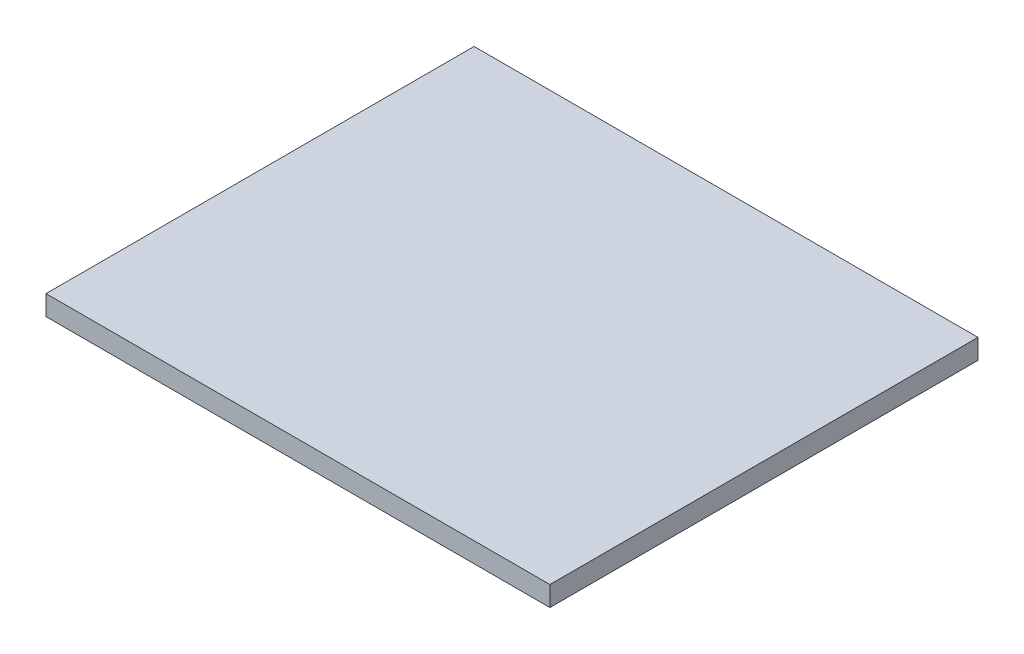
ISO-10303-21;
HEADER;
FILE_DESCRIPTION(('STEP AP214'),'2;1');
FILE_NAME('part.step','',(''),(''),'','','');
FILE_SCHEMA(('AUTOMOTIVE_DESIGN { 1 0 10303 214 1 1 1 1 }'));
ENDSEC;
DATA;
#1=APPLICATION_CONTEXT('core data for automotive mechanical design processes');
#2=APPLICATION_PROTOCOL_DEFINITION('international standard','automotive_design',2000,#1);
#3=PRODUCT_CONTEXT('',#1,'mechanical');
#4=PRODUCT('Part','Part','',(#3));
#5=PRODUCT_RELATED_PRODUCT_CATEGORY('part','',(#4));
#6=PRODUCT_DEFINITION_FORMATION('','',#4);
#7=PRODUCT_DEFINITION_CONTEXT('part definition',#1,'design');
#8=PRODUCT_DEFINITION('design','',#6,#7);
#9=PRODUCT_DEFINITION_SHAPE('','',#8);
#10=(LENGTH_UNIT() NAMED_UNIT(*) SI_UNIT(.MILLI.,.METRE.));
#11=(NAMED_UNIT(*) PLANE_ANGLE_UNIT() SI_UNIT($,.RADIAN.));
#12=(NAMED_UNIT(*) SI_UNIT($,.STERADIAN.) SOLID_ANGLE_UNIT());
#13=UNCERTAINTY_MEASURE_WITH_UNIT(LENGTH_MEASURE(1.E-05),#10,'distance_accuracy_value','');
#14=(GEOMETRIC_REPRESENTATION_CONTEXT(3) GLOBAL_UNCERTAINTY_ASSIGNED_CONTEXT((#13)) GLOBAL_UNIT_ASSIGNED_CONTEXT((#10,
#11,#12)) REPRESENTATION_CONTEXT('',''));
#15=CARTESIAN_POINT('',(0.,0.,0.));
#16=DIRECTION('',(0.,0.,1.));
#17=DIRECTION('',(1.,0.,0.));
#18=AXIS2_PLACEMENT_3D('',#15,#16,#17);
#19=CARTESIAN_POINT('',(0.,3.,0.));
#20=DIRECTION('',(1.,0.,0.));
#21=DIRECTION('',(0.,0.,-1.));
#22=AXIS2_PLACEMENT_3D('',#19,#20,#21);
#23=PLANE('',#22);
#24=DIRECTION('',(0.,0.,1.));
#25=VECTOR('',#24,1.);
#26=CARTESIAN_POINT('',(0.,0.,0.));
#27=LINE('',#26,#25);
#28=CARTESIAN_POINT('',(0.,0.,0.));
#29=VERTEX_POINT('',#28);
#30=CARTESIAN_POINT('',(0.,0.,64.4));
#31=VERTEX_POINT('',#30);
#32=EDGE_CURVE('E107',#29,#31,#27,.T.);
#33=ORIENTED_EDGE('',*,*,#32,.T.);
#34=DIRECTION('',(0.,-1.,0.));
#35=VECTOR('',#34,1.);
#36=CARTESIAN_POINT('',(0.,3.,64.4));
#37=LINE('',#36,#35);
#38=CARTESIAN_POINT('',(0.,3.,64.4));
#39=VERTEX_POINT('',#38);
#40=EDGE_CURVE('E11',#39,#31,#37,.T.);
#41=ORIENTED_EDGE('',*,*,#40,.F.);
#42=DIRECTION('',(0.,0.,1.));
#43=VECTOR('',#42,1.);
#44=CARTESIAN_POINT('',(0.,3.,0.));
#45=LINE('',#44,#43);
#46=CARTESIAN_POINT('',(0.,3.,0.));
#47=VERTEX_POINT('',#46);
#48=EDGE_CURVE('E89',#47,#39,#45,.T.);
#49=ORIENTED_EDGE('',*,*,#48,.F.);
#50=DIRECTION('',(0.,-1.,0.));
#51=VECTOR('',#50,1.);
#52=CARTESIAN_POINT('',(0.,3.,0.));
#53=LINE('',#52,#51);
#54=EDGE_CURVE('E56',#47,#29,#53,.T.);
#55=ORIENTED_EDGE('',*,*,#54,.T.);
#56=EDGE_LOOP('',(#33,#41,#49,#55));
#57=FACE_BOUND('',#56,.T.);
#58=ADVANCED_FACE('F39',(#57),#23,.F.);
#59=CARTESIAN_POINT('',(0.,3.,64.4));
#60=DIRECTION('',(0.,0.,-1.));
#61=DIRECTION('',(-1.,0.,0.));
#62=AXIS2_PLACEMENT_3D('',#59,#60,#61);
#63=PLANE('',#62);
#64=DIRECTION('',(1.,0.,0.));
#65=VECTOR('',#64,1.);
#66=CARTESIAN_POINT('',(0.,0.,64.4));
#67=LINE('',#66,#65);
#68=CARTESIAN_POINT('',(75.8,0.,64.4));
#69=VERTEX_POINT('',#68);
#70=EDGE_CURVE('E95',#31,#69,#67,.T.);
#71=ORIENTED_EDGE('',*,*,#70,.T.);
#72=DIRECTION('',(0.,-1.,0.));
#73=VECTOR('',#72,1.);
#74=CARTESIAN_POINT('',(75.8,3.,64.4));
#75=LINE('',#74,#73);
#76=CARTESIAN_POINT('',(75.8,3.,64.4));
#77=VERTEX_POINT('',#76);
#78=EDGE_CURVE('E48',#77,#69,#75,.T.);
#79=ORIENTED_EDGE('',*,*,#78,.F.);
#80=DIRECTION('',(1.,0.,0.));
#81=VECTOR('',#80,1.);
#82=CARTESIAN_POINT('',(0.,3.,64.4));
#83=LINE('',#82,#81);
#84=EDGE_CURVE('E81',#39,#77,#83,.T.);
#85=ORIENTED_EDGE('',*,*,#84,.F.);
#86=ORIENTED_EDGE('',*,*,#40,.T.);
#87=EDGE_LOOP('',(#71,#79,#85,#86));
#88=FACE_BOUND('',#87,.T.);
#89=ADVANCED_FACE('F94',(#88),#63,.F.);
#90=CARTESIAN_POINT('',(75.8,3.,0.));
#91=DIRECTION('',(1.,0.,0.));
#92=DIRECTION('',(0.,0.,-1.));
#93=AXIS2_PLACEMENT_3D('',#90,#91,#92);
#94=PLANE('',#93);
#95=DIRECTION('',(0.,0.,1.));
#96=VECTOR('',#95,1.);
#97=CARTESIAN_POINT('',(75.8,0.,0.));
#98=LINE('',#97,#96);
#99=CARTESIAN_POINT('',(75.8,0.,0.));
#100=VERTEX_POINT('',#99);
#101=EDGE_CURVE('E112',#100,#69,#98,.T.);
#102=ORIENTED_EDGE('',*,*,#101,.F.);
#103=DIRECTION('',(0.,-1.,0.));
#104=VECTOR('',#103,1.);
#105=CARTESIAN_POINT('',(75.8,3.,0.));
#106=LINE('',#105,#104);
#107=CARTESIAN_POINT('',(75.8,3.,0.));
#108=VERTEX_POINT('',#107);
#109=EDGE_CURVE('E70',#108,#100,#106,.T.);
#110=ORIENTED_EDGE('',*,*,#109,.F.);
#111=DIRECTION('',(0.,0.,1.));
#112=VECTOR('',#111,1.);
#113=CARTESIAN_POINT('',(75.8,3.,0.));
#114=LINE('',#113,#112);
#115=EDGE_CURVE('E88',#108,#77,#114,.T.);
#116=ORIENTED_EDGE('',*,*,#115,.T.);
#117=ORIENTED_EDGE('',*,*,#78,.T.);
#118=EDGE_LOOP('',(#102,#110,#116,#117));
#119=FACE_BOUND('',#118,.T.);
#120=ADVANCED_FACE('F99',(#119),#94,.T.);
#121=CARTESIAN_POINT('',(0.,3.,0.));
#122=DIRECTION('',(0.,0.,-1.));
#123=DIRECTION('',(-1.,0.,0.));
#124=AXIS2_PLACEMENT_3D('',#121,#122,#123);
#125=PLANE('',#124);
#126=DIRECTION('',(1.,0.,0.));
#127=VECTOR('',#126,1.);
#128=CARTESIAN_POINT('',(0.,0.,0.));
#129=LINE('',#128,#127);
#130=EDGE_CURVE('E115',#29,#100,#129,.T.);
#131=ORIENTED_EDGE('',*,*,#130,.F.);
#132=ORIENTED_EDGE('',*,*,#54,.F.);
#133=DIRECTION('',(1.,0.,0.));
#134=VECTOR('',#133,1.);
#135=CARTESIAN_POINT('',(0.,3.,0.));
#136=LINE('',#135,#134);
#137=EDGE_CURVE('E101',#47,#108,#136,.T.);
#138=ORIENTED_EDGE('',*,*,#137,.T.);
#139=ORIENTED_EDGE('',*,*,#109,.T.);
#140=EDGE_LOOP('',(#131,#132,#138,#139));
#141=FACE_BOUND('',#140,.T.);
#142=ADVANCED_FACE('F125',(#141),#125,.T.);
#143=CARTESIAN_POINT('',(0.,3.,0.));
#144=DIRECTION('',(0.,1.,0.));
#145=DIRECTION('',(0.,0.,1.));
#146=AXIS2_PLACEMENT_3D('',#143,#144,#145);
#147=PLANE('',#146);
#148=ORIENTED_EDGE('',*,*,#48,.T.);
#149=ORIENTED_EDGE('',*,*,#84,.T.);
#150=ORIENTED_EDGE('',*,*,#115,.F.);
#151=ORIENTED_EDGE('',*,*,#137,.F.);
#152=EDGE_LOOP('',(#148,#149,#150,#151));
#153=FACE_BOUND('',#152,.T.);
#154=ADVANCED_FACE('F85',(#153),#147,.T.);
#155=CARTESIAN_POINT('',(0.,0.,0.));
#156=DIRECTION('',(0.,1.,0.));
#157=DIRECTION('',(0.,0.,1.));
#158=AXIS2_PLACEMENT_3D('',#155,#156,#157);
#159=PLANE('',#158);
#160=ORIENTED_EDGE('',*,*,#32,.F.);
#161=ORIENTED_EDGE('',*,*,#130,.T.);
#162=ORIENTED_EDGE('',*,*,#101,.T.);
#163=ORIENTED_EDGE('',*,*,#70,.F.);
#164=EDGE_LOOP('',(#160,#161,#162,#163));
#165=FACE_BOUND('',#164,.T.);
#166=ADVANCED_FACE('F124',(#165),#159,.F.);
#167=CLOSED_SHELL('',(#58,#89,#120,#142,#154,#166));
#168=MANIFOLD_SOLID_BREP('B2',#167);
#169=ADVANCED_BREP_SHAPE_REPRESENTATION('',(#18,#168),#14);
#170=SHAPE_DEFINITION_REPRESENTATION(#9,#169);
ENDSEC;
END-ISO-10303-21;
